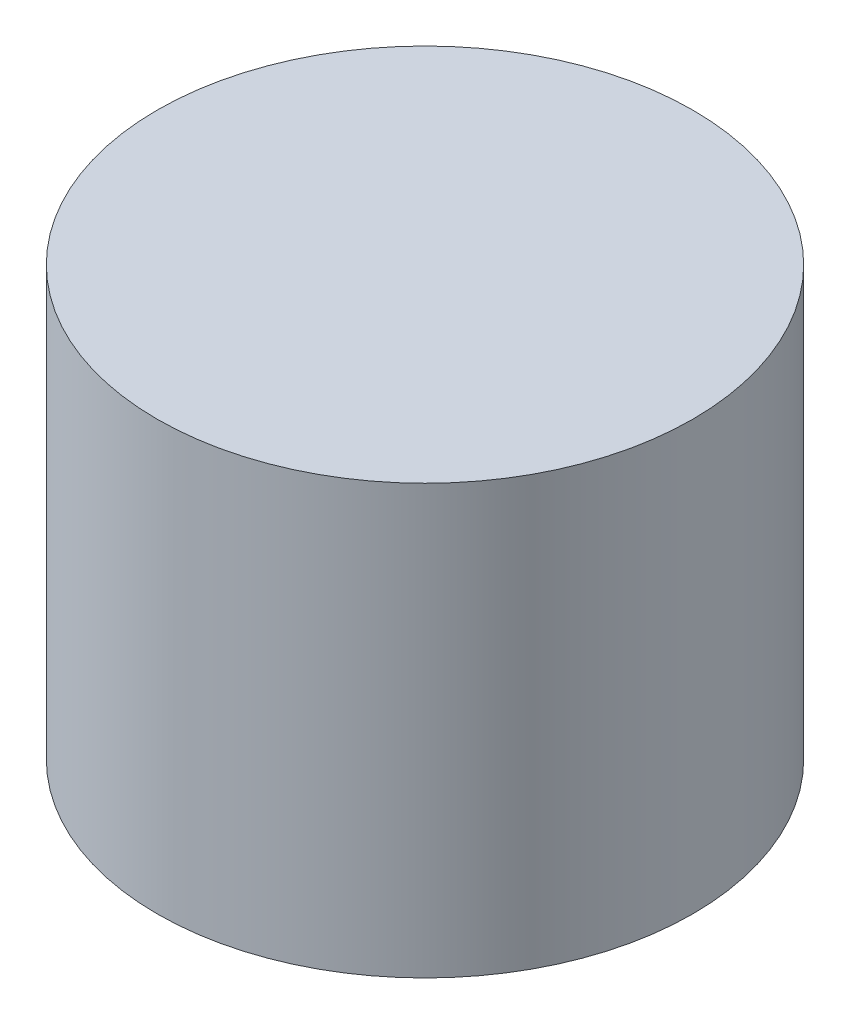
ISO-10303-21;
HEADER;
FILE_DESCRIPTION(('STEP AP214'),'2;1');
FILE_NAME('part.step','',(''),(''),'','','');
FILE_SCHEMA(('AUTOMOTIVE_DESIGN { 1 0 10303 214 1 1 1 1 }'));
ENDSEC;
DATA;
#1=APPLICATION_CONTEXT('core data for automotive mechanical design processes');
#2=APPLICATION_PROTOCOL_DEFINITION('international standard','automotive_design',2000,#1);
#3=PRODUCT_CONTEXT('',#1,'mechanical');
#4=PRODUCT('Part','Part','',(#3));
#5=PRODUCT_RELATED_PRODUCT_CATEGORY('part','',(#4));
#6=PRODUCT_DEFINITION_FORMATION('','',#4);
#7=PRODUCT_DEFINITION_CONTEXT('part definition',#1,'design');
#8=PRODUCT_DEFINITION('design','',#6,#7);
#9=PRODUCT_DEFINITION_SHAPE('','',#8);
#10=(LENGTH_UNIT() NAMED_UNIT(*) SI_UNIT(.MILLI.,.METRE.));
#11=(NAMED_UNIT(*) PLANE_ANGLE_UNIT() SI_UNIT($,.RADIAN.));
#12=(NAMED_UNIT(*) SI_UNIT($,.STERADIAN.) SOLID_ANGLE_UNIT());
#13=UNCERTAINTY_MEASURE_WITH_UNIT(LENGTH_MEASURE(1.E-05),#10,'distance_accuracy_value','');
#14=(GEOMETRIC_REPRESENTATION_CONTEXT(3) GLOBAL_UNCERTAINTY_ASSIGNED_CONTEXT((#13)) GLOBAL_UNIT_ASSIGNED_CONTEXT((#10,
#11,#12)) REPRESENTATION_CONTEXT('',''));
#15=CARTESIAN_POINT('',(0.,0.,0.));
#16=DIRECTION('',(0.,0.,1.));
#17=DIRECTION('',(1.,0.,0.));
#18=AXIS2_PLACEMENT_3D('',#15,#16,#17);
#19=CARTESIAN_POINT('',(0.,6.35,0.));
#20=DIRECTION('',(0.,-1.,0.));
#21=DIRECTION('',(0.,0.,-1.));
#22=AXIS2_PLACEMENT_3D('',#19,#20,#21);
#23=CYLINDRICAL_SURFACE('',#22,3.96875);
#24=CARTESIAN_POINT('',(0.,6.35,0.));
#25=DIRECTION('',(0.,1.,0.));
#26=DIRECTION('',(0.,0.,1.));
#27=AXIS2_PLACEMENT_3D('',#24,#25,#26);
#28=CIRCLE('',#27,3.96875);
#29=CARTESIAN_POINT('',(0.,6.35,3.96875));
#30=VERTEX_POINT('',#29);
#31=EDGE_CURVE('E10',#30,#30,#28,.T.);
#32=ORIENTED_EDGE('',*,*,#31,.F.);
#33=EDGE_LOOP('',(#32));
#34=FACE_BOUND('',#33,.T.);
#35=CARTESIAN_POINT('',(0.,0.,0.));
#36=DIRECTION('',(0.,1.,0.));
#37=DIRECTION('',(0.,0.,1.));
#38=AXIS2_PLACEMENT_3D('',#35,#36,#37);
#39=CIRCLE('',#38,3.96875);
#40=CARTESIAN_POINT('',(0.,0.,3.96875));
#41=VERTEX_POINT('',#40);
#42=EDGE_CURVE('E34',#41,#41,#39,.T.);
#43=ORIENTED_EDGE('',*,*,#42,.T.);
#44=EDGE_LOOP('',(#43));
#45=FACE_BOUND('',#44,.T.);
#46=ADVANCED_FACE('F31',(#34,#45),#23,.T.);
#47=CARTESIAN_POINT('',(0.,6.35,0.));
#48=DIRECTION('',(0.,1.,0.));
#49=DIRECTION('',(0.,0.,1.));
#50=AXIS2_PLACEMENT_3D('',#47,#48,#49);
#51=PLANE('',#50);
#52=ORIENTED_EDGE('',*,*,#31,.T.);
#53=EDGE_LOOP('',(#52));
#54=FACE_BOUND('',#53,.T.);
#55=ADVANCED_FACE('F46',(#54),#51,.T.);
#56=CARTESIAN_POINT('',(0.,0.,0.));
#57=DIRECTION('',(0.,1.,0.));
#58=DIRECTION('',(0.,0.,1.));
#59=AXIS2_PLACEMENT_3D('',#56,#57,#58);
#60=PLANE('',#59);
#61=ORIENTED_EDGE('',*,*,#42,.F.);
#62=EDGE_LOOP('',(#61));
#63=FACE_BOUND('',#62,.T.);
#64=ADVANCED_FACE('F44',(#63),#60,.F.);
#65=CLOSED_SHELL('',(#46,#55,#64));
#66=MANIFOLD_SOLID_BREP('B2',#65);
#67=ADVANCED_BREP_SHAPE_REPRESENTATION('',(#18,#66),#14);
#68=SHAPE_DEFINITION_REPRESENTATION(#9,#67);
ENDSEC;
END-ISO-10303-21;
